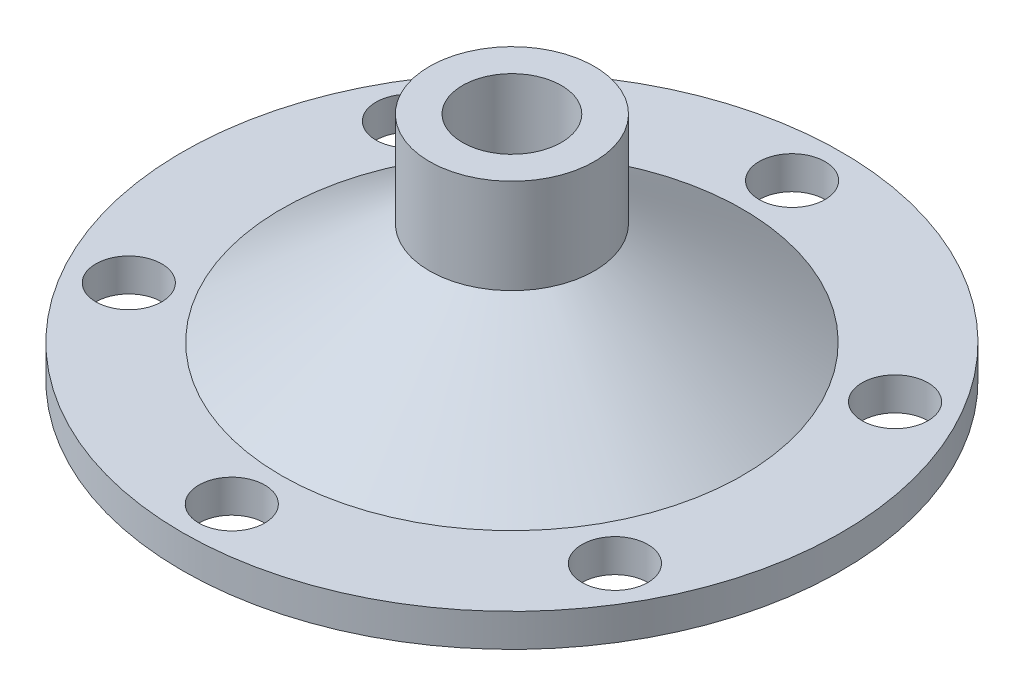
ISO-10303-21;
HEADER;
FILE_DESCRIPTION(('STEP AP214'),'2;1');
FILE_NAME('part.step','',(''),(''),'','','');
FILE_SCHEMA(('AUTOMOTIVE_DESIGN { 1 0 10303 214 1 1 1 1 }'));
ENDSEC;
DATA;
#1=APPLICATION_CONTEXT('core data for automotive mechanical design processes');
#2=APPLICATION_PROTOCOL_DEFINITION('international standard','automotive_design',2000,#1);
#3=PRODUCT_CONTEXT('',#1,'mechanical');
#4=PRODUCT('Part','Part','',(#3));
#5=PRODUCT_RELATED_PRODUCT_CATEGORY('part','',(#4));
#6=PRODUCT_DEFINITION_FORMATION('','',#4);
#7=PRODUCT_DEFINITION_CONTEXT('part definition',#1,'design');
#8=PRODUCT_DEFINITION('design','',#6,#7);
#9=PRODUCT_DEFINITION_SHAPE('','',#8);
#10=(LENGTH_UNIT() NAMED_UNIT(*) SI_UNIT(.MILLI.,.METRE.));
#11=(NAMED_UNIT(*) PLANE_ANGLE_UNIT() SI_UNIT($,.RADIAN.));
#12=(NAMED_UNIT(*) SI_UNIT($,.STERADIAN.) SOLID_ANGLE_UNIT());
#13=UNCERTAINTY_MEASURE_WITH_UNIT(LENGTH_MEASURE(1.E-05),#10,'distance_accuracy_value','');
#14=(GEOMETRIC_REPRESENTATION_CONTEXT(3) GLOBAL_UNCERTAINTY_ASSIGNED_CONTEXT((#13)) GLOBAL_UNIT_ASSIGNED_CONTEXT((#10,
#11,#12)) REPRESENTATION_CONTEXT('',''));
#15=CARTESIAN_POINT('',(0.,0.,0.));
#16=DIRECTION('',(0.,0.,1.));
#17=DIRECTION('',(1.,0.,0.));
#18=AXIS2_PLACEMENT_3D('',#15,#16,#17);
#19=CARTESIAN_POINT('',(0.,12.7,0.));
#20=DIRECTION('',(0.,-1.,0.));
#21=DIRECTION('',(0.,0.,-1.));
#22=AXIS2_PLACEMENT_3D('',#19,#20,#21);
#23=CYLINDRICAL_SURFACE('',#22,127.);
#24=CARTESIAN_POINT('',(0.,12.7,0.));
#25=DIRECTION('',(0.,1.,0.));
#26=DIRECTION('',(0.,0.,1.));
#27=AXIS2_PLACEMENT_3D('',#24,#25,#26);
#28=CIRCLE('',#27,127.);
#29=CARTESIAN_POINT('',(0.,12.7,127.));
#30=VERTEX_POINT('',#29);
#31=EDGE_CURVE('E38',#30,#30,#28,.T.);
#32=ORIENTED_EDGE('',*,*,#31,.F.);
#33=EDGE_LOOP('',(#32));
#34=FACE_BOUND('',#33,.T.);
#35=CARTESIAN_POINT('',(0.,0.,0.));
#36=DIRECTION('',(0.,1.,0.));
#37=DIRECTION('',(0.,0.,1.));
#38=AXIS2_PLACEMENT_3D('',#35,#36,#37);
#39=CIRCLE('',#38,127.);
#40=CARTESIAN_POINT('',(0.,0.,127.));
#41=VERTEX_POINT('',#40);
#42=EDGE_CURVE('E42',#41,#41,#39,.T.);
#43=ORIENTED_EDGE('',*,*,#42,.T.);
#44=EDGE_LOOP('',(#43));
#45=FACE_BOUND('',#44,.T.);
#46=ADVANCED_FACE('F31',(#34,#45),#23,.T.);
#47=CARTESIAN_POINT('',(0.,12.7,0.));
#48=DIRECTION('',(0.,1.,0.));
#49=DIRECTION('',(0.,0.,1.));
#50=AXIS2_PLACEMENT_3D('',#47,#48,#49);
#51=PLANE('',#50);
#52=CARTESIAN_POINT('',(0.,12.7,0.));
#53=DIRECTION('',(0.,1.,0.));
#54=DIRECTION('',(0.,0.,1.));
#55=AXIS2_PLACEMENT_3D('',#52,#53,#54);
#56=CIRCLE('',#55,88.9);
#57=CARTESIAN_POINT('',(0.,12.7,88.9));
#58=VERTEX_POINT('',#57);
#59=EDGE_CURVE('E78',#58,#58,#56,.T.);
#60=ORIENTED_EDGE('',*,*,#59,.F.);
#61=EDGE_LOOP('',(#60));
#62=FACE_BOUND('',#61,.T.);
#63=CARTESIAN_POINT('',(0.,12.7,-107.95));
#64=DIRECTION('',(0.,1.,0.));
#65=DIRECTION('',(0.,0.,1.));
#66=AXIS2_PLACEMENT_3D('',#63,#64,#65);
#67=CIRCLE('',#66,12.7);
#68=CARTESIAN_POINT('',(0.,12.7,-95.25));
#69=VERTEX_POINT('',#68);
#70=EDGE_CURVE('E62',#69,#69,#67,.T.);
#71=ORIENTED_EDGE('',*,*,#70,.F.);
#72=EDGE_LOOP('',(#71));
#73=FACE_BOUND('',#72,.T.);
#74=CARTESIAN_POINT('',(93.6625,12.7,53.975));
#75=DIRECTION('',(0.,1.,0.));
#76=DIRECTION('',(0.,0.,1.));
#77=AXIS2_PLACEMENT_3D('',#74,#75,#76);
#78=CIRCLE('',#77,12.7);
#79=CARTESIAN_POINT('',(93.6625,12.7,66.675));
#80=VERTEX_POINT('',#79);
#81=EDGE_CURVE('E75',#80,#80,#78,.T.);
#82=ORIENTED_EDGE('',*,*,#81,.F.);
#83=EDGE_LOOP('',(#82));
#84=FACE_BOUND('',#83,.T.);
#85=CARTESIAN_POINT('',(0.,12.7,107.95));
#86=DIRECTION('',(0.,1.,0.));
#87=DIRECTION('',(0.,0.,1.));
#88=AXIS2_PLACEMENT_3D('',#85,#86,#87);
#89=CIRCLE('',#88,12.7);
#90=CARTESIAN_POINT('',(0.,12.7,120.65));
#91=VERTEX_POINT('',#90);
#92=EDGE_CURVE('E56',#91,#91,#89,.T.);
#93=ORIENTED_EDGE('',*,*,#92,.F.);
#94=EDGE_LOOP('',(#93));
#95=FACE_BOUND('',#94,.T.);
#96=CARTESIAN_POINT('',(-93.6625,12.7,-53.975));
#97=DIRECTION('',(0.,1.,0.));
#98=DIRECTION('',(0.,0.,1.));
#99=AXIS2_PLACEMENT_3D('',#96,#97,#98);
#100=CIRCLE('',#99,12.7);
#101=CARTESIAN_POINT('',(-93.6625,12.7,-41.275));
#102=VERTEX_POINT('',#101);
#103=EDGE_CURVE('E49',#102,#102,#100,.T.);
#104=ORIENTED_EDGE('',*,*,#103,.F.);
#105=EDGE_LOOP('',(#104));
#106=FACE_BOUND('',#105,.T.);
#107=CARTESIAN_POINT('',(93.6625,12.7,-53.975));
#108=DIRECTION('',(0.,1.,0.));
#109=DIRECTION('',(0.,0.,1.));
#110=AXIS2_PLACEMENT_3D('',#107,#108,#109);
#111=CIRCLE('',#110,12.7);
#112=CARTESIAN_POINT('',(93.6625,12.7,-41.275));
#113=VERTEX_POINT('',#112);
#114=EDGE_CURVE('E70',#113,#113,#111,.T.);
#115=ORIENTED_EDGE('',*,*,#114,.F.);
#116=EDGE_LOOP('',(#115));
#117=FACE_BOUND('',#116,.T.);
#118=CARTESIAN_POINT('',(-93.6625,12.7,53.975));
#119=DIRECTION('',(0.,1.,0.));
#120=DIRECTION('',(0.,0.,1.));
#121=AXIS2_PLACEMENT_3D('',#118,#119,#120);
#122=CIRCLE('',#121,12.7);
#123=CARTESIAN_POINT('',(-93.6625,12.7,66.675));
#124=VERTEX_POINT('',#123);
#125=EDGE_CURVE('E63',#124,#124,#122,.T.);
#126=ORIENTED_EDGE('',*,*,#125,.F.);
#127=EDGE_LOOP('',(#126));
#128=FACE_BOUND('',#127,.T.);
#129=ORIENTED_EDGE('',*,*,#31,.T.);
#130=EDGE_LOOP('',(#129));
#131=FACE_BOUND('',#130,.T.);
#132=ADVANCED_FACE('F116',(#62,#73,#84,#95,#106,#117,#128,#131),#51,.T.);
#133=CARTESIAN_POINT('',(0.,0.,0.));
#134=DIRECTION('',(0.,1.,0.));
#135=DIRECTION('',(0.,0.,1.));
#136=AXIS2_PLACEMENT_3D('',#133,#134,#135);
#137=PLANE('',#136);
#138=CARTESIAN_POINT('',(0.,0.,0.));
#139=DIRECTION('',(0.,1.,0.));
#140=DIRECTION('',(0.,0.,1.));
#141=AXIS2_PLACEMENT_3D('',#138,#139,#140);
#142=CIRCLE('',#141,19.05);
#143=CARTESIAN_POINT('',(0.,0.,19.05));
#144=VERTEX_POINT('',#143);
#145=EDGE_CURVE('E90',#144,#144,#142,.T.);
#146=ORIENTED_EDGE('',*,*,#145,.T.);
#147=EDGE_LOOP('',(#146));
#148=FACE_BOUND('',#147,.T.);
#149=CARTESIAN_POINT('',(0.,0.,-107.95));
#150=DIRECTION('',(0.,1.,0.));
#151=DIRECTION('',(0.,0.,1.));
#152=AXIS2_PLACEMENT_3D('',#149,#150,#151);
#153=CIRCLE('',#152,12.7);
#154=CARTESIAN_POINT('',(0.,0.,-95.25));
#155=VERTEX_POINT('',#154);
#156=EDGE_CURVE('E47',#155,#155,#153,.T.);
#157=ORIENTED_EDGE('',*,*,#156,.T.);
#158=EDGE_LOOP('',(#157));
#159=FACE_BOUND('',#158,.T.);
#160=CARTESIAN_POINT('',(93.6625,0.,53.975));
#161=DIRECTION('',(0.,1.,0.));
#162=DIRECTION('',(0.,0.,1.));
#163=AXIS2_PLACEMENT_3D('',#160,#161,#162);
#164=CIRCLE('',#163,12.7);
#165=CARTESIAN_POINT('',(93.6625,0.,66.675));
#166=VERTEX_POINT('',#165);
#167=EDGE_CURVE('E67',#166,#166,#164,.T.);
#168=ORIENTED_EDGE('',*,*,#167,.T.);
#169=EDGE_LOOP('',(#168));
#170=FACE_BOUND('',#169,.T.);
#171=CARTESIAN_POINT('',(0.,0.,107.95));
#172=DIRECTION('',(0.,1.,0.));
#173=DIRECTION('',(0.,0.,1.));
#174=AXIS2_PLACEMENT_3D('',#171,#172,#173);
#175=CIRCLE('',#174,12.7);
#176=CARTESIAN_POINT('',(0.,0.,120.65));
#177=VERTEX_POINT('',#176);
#178=EDGE_CURVE('E59',#177,#177,#175,.T.);
#179=ORIENTED_EDGE('',*,*,#178,.T.);
#180=EDGE_LOOP('',(#179));
#181=FACE_BOUND('',#180,.T.);
#182=CARTESIAN_POINT('',(-93.6625,0.,-53.975));
#183=DIRECTION('',(0.,1.,0.));
#184=DIRECTION('',(0.,0.,1.));
#185=AXIS2_PLACEMENT_3D('',#182,#183,#184);
#186=CIRCLE('',#185,12.7);
#187=CARTESIAN_POINT('',(-93.6625,0.,-41.275));
#188=VERTEX_POINT('',#187);
#189=EDGE_CURVE('E52',#188,#188,#186,.T.);
#190=ORIENTED_EDGE('',*,*,#189,.T.);
#191=EDGE_LOOP('',(#190));
#192=FACE_BOUND('',#191,.T.);
#193=CARTESIAN_POINT('',(93.6625,0.,-53.975));
#194=DIRECTION('',(0.,1.,0.));
#195=DIRECTION('',(0.,0.,1.));
#196=AXIS2_PLACEMENT_3D('',#193,#194,#195);
#197=CIRCLE('',#196,12.7);
#198=CARTESIAN_POINT('',(93.6625,0.,-41.275));
#199=VERTEX_POINT('',#198);
#200=EDGE_CURVE('E53',#199,#199,#197,.T.);
#201=ORIENTED_EDGE('',*,*,#200,.T.);
#202=EDGE_LOOP('',(#201));
#203=FACE_BOUND('',#202,.T.);
#204=CARTESIAN_POINT('',(-93.6625,0.,53.975));
#205=DIRECTION('',(0.,1.,0.));
#206=DIRECTION('',(0.,0.,1.));
#207=AXIS2_PLACEMENT_3D('',#204,#205,#206);
#208=CIRCLE('',#207,12.7);
#209=CARTESIAN_POINT('',(-93.6625,0.,66.675));
#210=VERTEX_POINT('',#209);
#211=EDGE_CURVE('E66',#210,#210,#208,.T.);
#212=ORIENTED_EDGE('',*,*,#211,.T.);
#213=EDGE_LOOP('',(#212));
#214=FACE_BOUND('',#213,.T.);
#215=ORIENTED_EDGE('',*,*,#42,.F.);
#216=EDGE_LOOP('',(#215));
#217=FACE_BOUND('',#216,.T.);
#218=ADVANCED_FACE('F121',(#148,#159,#170,#181,#192,#203,#214,#217),#137,.F.);
#219=CARTESIAN_POINT('',(-93.6625,0.,53.975));
#220=DIRECTION('',(0.,1.,0.));
#221=DIRECTION('',(0.,0.,1.));
#222=AXIS2_PLACEMENT_3D('',#219,#220,#221);
#223=CYLINDRICAL_SURFACE('',#222,12.7);
#224=ORIENTED_EDGE('',*,*,#211,.F.);
#225=EDGE_LOOP('',(#224));
#226=FACE_BOUND('',#225,.T.);
#227=ORIENTED_EDGE('',*,*,#125,.T.);
#228=EDGE_LOOP('',(#227));
#229=FACE_BOUND('',#228,.T.);
#230=ADVANCED_FACE('F127',(#226,#229),#223,.F.);
#231=CARTESIAN_POINT('',(93.6625,0.,-53.975));
#232=DIRECTION('',(0.,1.,0.));
#233=DIRECTION('',(0.,0.,1.));
#234=AXIS2_PLACEMENT_3D('',#231,#232,#233);
#235=CYLINDRICAL_SURFACE('',#234,12.7);
#236=ORIENTED_EDGE('',*,*,#200,.F.);
#237=EDGE_LOOP('',(#236));
#238=FACE_BOUND('',#237,.T.);
#239=ORIENTED_EDGE('',*,*,#114,.T.);
#240=EDGE_LOOP('',(#239));
#241=FACE_BOUND('',#240,.T.);
#242=ADVANCED_FACE('F134',(#238,#241),#235,.F.);
#243=CARTESIAN_POINT('',(-93.6625,0.,-53.975));
#244=DIRECTION('',(0.,1.,0.));
#245=DIRECTION('',(0.,0.,1.));
#246=AXIS2_PLACEMENT_3D('',#243,#244,#245);
#247=CYLINDRICAL_SURFACE('',#246,12.7);
#248=ORIENTED_EDGE('',*,*,#189,.F.);
#249=EDGE_LOOP('',(#248));
#250=FACE_BOUND('',#249,.T.);
#251=ORIENTED_EDGE('',*,*,#103,.T.);
#252=EDGE_LOOP('',(#251));
#253=FACE_BOUND('',#252,.T.);
#254=ADVANCED_FACE('F130',(#250,#253),#247,.F.);
#255=CARTESIAN_POINT('',(0.,0.,107.95));
#256=DIRECTION('',(0.,1.,0.));
#257=DIRECTION('',(0.,0.,1.));
#258=AXIS2_PLACEMENT_3D('',#255,#256,#257);
#259=CYLINDRICAL_SURFACE('',#258,12.7);
#260=ORIENTED_EDGE('',*,*,#178,.F.);
#261=EDGE_LOOP('',(#260));
#262=FACE_BOUND('',#261,.T.);
#263=ORIENTED_EDGE('',*,*,#92,.T.);
#264=EDGE_LOOP('',(#263));
#265=FACE_BOUND('',#264,.T.);
#266=ADVANCED_FACE('F133',(#262,#265),#259,.F.);
#267=CARTESIAN_POINT('',(93.6625,0.,53.975));
#268=DIRECTION('',(0.,1.,0.));
#269=DIRECTION('',(0.,0.,1.));
#270=AXIS2_PLACEMENT_3D('',#267,#268,#269);
#271=CYLINDRICAL_SURFACE('',#270,12.7);
#272=ORIENTED_EDGE('',*,*,#167,.F.);
#273=EDGE_LOOP('',(#272));
#274=FACE_BOUND('',#273,.T.);
#275=ORIENTED_EDGE('',*,*,#81,.T.);
#276=EDGE_LOOP('',(#275));
#277=FACE_BOUND('',#276,.T.);
#278=ADVANCED_FACE('F138',(#274,#277),#271,.F.);
#279=CARTESIAN_POINT('',(0.,0.,-107.95));
#280=DIRECTION('',(0.,1.,0.));
#281=DIRECTION('',(0.,0.,1.));
#282=AXIS2_PLACEMENT_3D('',#279,#280,#281);
#283=CYLINDRICAL_SURFACE('',#282,12.7);
#284=ORIENTED_EDGE('',*,*,#156,.F.);
#285=EDGE_LOOP('',(#284));
#286=FACE_BOUND('',#285,.T.);
#287=ORIENTED_EDGE('',*,*,#70,.T.);
#288=EDGE_LOOP('',(#287));
#289=FACE_BOUND('',#288,.T.);
#290=ADVANCED_FACE('F112',(#286,#289),#283,.F.);
#291=CARTESIAN_POINT('',(0.,52.3875,0.));
#292=DIRECTION('',(0.,-1.,0.));
#293=DIRECTION('',(0.,0.,-1.));
#294=AXIS2_PLACEMENT_3D('',#291,#292,#293);
#295=CONICAL_SURFACE('',#294,31.775899267408,0.963596280026068);
#296=ORIENTED_EDGE('',*,*,#59,.T.);
#297=EDGE_LOOP('',(#296));
#298=FACE_BOUND('',#297,.T.);
#299=CARTESIAN_POINT('',(0.,52.3875,0.));
#300=DIRECTION('',(0.,1.,0.));
#301=DIRECTION('',(0.,0.,1.));
#302=AXIS2_PLACEMENT_3D('',#299,#300,#301);
#303=CIRCLE('',#302,31.775899267408);
#304=CARTESIAN_POINT('',(0.,52.3875,31.775899267408));
#305=VERTEX_POINT('',#304);
#306=EDGE_CURVE('E10',#305,#305,#303,.T.);
#307=ORIENTED_EDGE('',*,*,#306,.F.);
#308=EDGE_LOOP('',(#307));
#309=FACE_BOUND('',#308,.T.);
#310=ADVANCED_FACE('F33',(#298,#309),#295,.T.);
#311=CARTESIAN_POINT('',(0.,88.9,0.));
#312=DIRECTION('',(0.,-1.,0.));
#313=DIRECTION('',(0.,0.,-1.));
#314=AXIS2_PLACEMENT_3D('',#311,#312,#313);
#315=CYLINDRICAL_SURFACE('',#314,31.775899267408);
#316=CARTESIAN_POINT('',(0.,88.9,0.));
#317=DIRECTION('',(0.,1.,0.));
#318=DIRECTION('',(0.,0.,1.));
#319=AXIS2_PLACEMENT_3D('',#316,#317,#318);
#320=CIRCLE('',#319,31.775899267408);
#321=CARTESIAN_POINT('',(0.,88.9,31.775899267408));
#322=VERTEX_POINT('',#321);
#323=EDGE_CURVE('E87',#322,#322,#320,.T.);
#324=ORIENTED_EDGE('',*,*,#323,.F.);
#325=EDGE_LOOP('',(#324));
#326=FACE_BOUND('',#325,.T.);
#327=ORIENTED_EDGE('',*,*,#306,.T.);
#328=EDGE_LOOP('',(#327));
#329=FACE_BOUND('',#328,.T.);
#330=ADVANCED_FACE('F103',(#326,#329),#315,.T.);
#331=CARTESIAN_POINT('',(0.,88.9,0.));
#332=DIRECTION('',(0.,1.,0.));
#333=DIRECTION('',(0.,0.,1.));
#334=AXIS2_PLACEMENT_3D('',#331,#332,#333);
#335=PLANE('',#334);
#336=CARTESIAN_POINT('',(0.,88.9,0.));
#337=DIRECTION('',(0.,1.,0.));
#338=DIRECTION('',(0.,0.,1.));
#339=AXIS2_PLACEMENT_3D('',#336,#337,#338);
#340=CIRCLE('',#339,19.05);
#341=CARTESIAN_POINT('',(0.,88.9,19.05));
#342=VERTEX_POINT('',#341);
#343=EDGE_CURVE('E93',#342,#342,#340,.T.);
#344=ORIENTED_EDGE('',*,*,#343,.F.);
#345=EDGE_LOOP('',(#344));
#346=FACE_BOUND('',#345,.T.);
#347=ORIENTED_EDGE('',*,*,#323,.T.);
#348=EDGE_LOOP('',(#347));
#349=FACE_BOUND('',#348,.T.);
#350=ADVANCED_FACE('F100',(#346,#349),#335,.T.);
#351=CARTESIAN_POINT('',(0.,-66.4845000000001,0.));
#352=DIRECTION('',(0.,1.,0.));
#353=DIRECTION('',(0.,0.,1.));
#354=AXIS2_PLACEMENT_3D('',#351,#352,#353);
#355=CYLINDRICAL_SURFACE('',#354,19.05);
#356=ORIENTED_EDGE('',*,*,#343,.T.);
#357=EDGE_LOOP('',(#356));
#358=FACE_BOUND('',#357,.T.);
#359=ORIENTED_EDGE('',*,*,#145,.F.);
#360=EDGE_LOOP('',(#359));
#361=FACE_BOUND('',#360,.T.);
#362=ADVANCED_FACE('F97',(#358,#361),#355,.F.);
#363=CLOSED_SHELL('',(#46,#132,#218,#230,#242,#254,#266,#278,#290,#310,#330,#350,#362));
#364=MANIFOLD_SOLID_BREP('B2',#363);
#365=ADVANCED_BREP_SHAPE_REPRESENTATION('',(#18,#364),#14);
#366=SHAPE_DEFINITION_REPRESENTATION(#9,#365);
ENDSEC;
END-ISO-10303-21;
